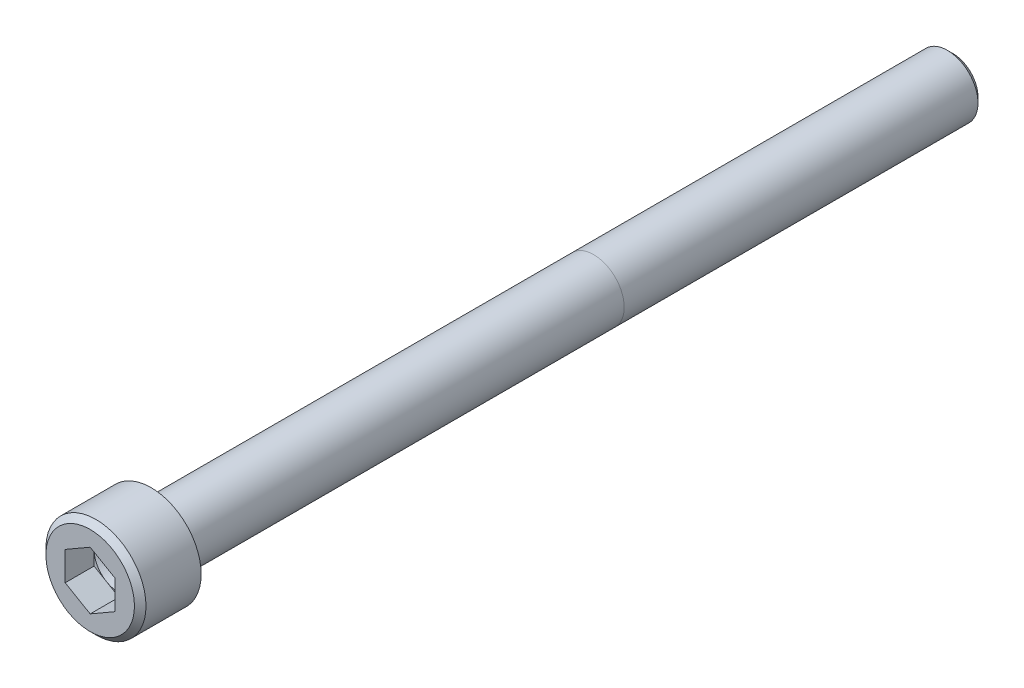
ISO-10303-21;
HEADER;
FILE_DESCRIPTION(('STEP AP214'),'2;1');
FILE_NAME('part.step','',(''),(''),'','','');
FILE_SCHEMA(('AUTOMOTIVE_DESIGN { 1 0 10303 214 1 1 1 1 }'));
ENDSEC;
DATA;
#1=APPLICATION_CONTEXT('core data for automotive mechanical design processes');
#2=APPLICATION_PROTOCOL_DEFINITION('international standard','automotive_design',2000,#1);
#3=PRODUCT_CONTEXT('',#1,'mechanical');
#4=PRODUCT('Part','Part','',(#3));
#5=PRODUCT_RELATED_PRODUCT_CATEGORY('part','',(#4));
#6=PRODUCT_DEFINITION_FORMATION('','',#4);
#7=PRODUCT_DEFINITION_CONTEXT('part definition',#1,'design');
#8=PRODUCT_DEFINITION('design','',#6,#7);
#9=PRODUCT_DEFINITION_SHAPE('','',#8);
#10=(LENGTH_UNIT() NAMED_UNIT(*) SI_UNIT(.MILLI.,.METRE.));
#11=(NAMED_UNIT(*) PLANE_ANGLE_UNIT() SI_UNIT($,.RADIAN.));
#12=(NAMED_UNIT(*) SI_UNIT($,.STERADIAN.) SOLID_ANGLE_UNIT());
#13=UNCERTAINTY_MEASURE_WITH_UNIT(LENGTH_MEASURE(1.E-05),#10,'distance_accuracy_value','');
#14=(GEOMETRIC_REPRESENTATION_CONTEXT(3) GLOBAL_UNCERTAINTY_ASSIGNED_CONTEXT((#13)) GLOBAL_UNIT_ASSIGNED_CONTEXT((#10,
#11,#12)) REPRESENTATION_CONTEXT('',''));
#15=CARTESIAN_POINT('',(0.,0.,0.));
#16=DIRECTION('',(0.,0.,1.));
#17=DIRECTION('',(1.,0.,0.));
#18=AXIS2_PLACEMENT_3D('',#15,#16,#17);
#19=CARTESIAN_POINT('',(0.,0.,-63.5));
#20=DIRECTION('',(0.,0.,1.));
#21=DIRECTION('',(1.,0.,0.));
#22=AXIS2_PLACEMENT_3D('',#19,#20,#21);
#23=CYLINDRICAL_SURFACE('',#22,2.413);
#24=CARTESIAN_POINT('',(0.,0.,-0.152399999999997));
#25=DIRECTION('',(0.,0.,1.));
#26=DIRECTION('',(1.,0.,0.));
#27=AXIS2_PLACEMENT_3D('',#24,#25,#26);
#28=CIRCLE('',#27,2.413);
#29=CARTESIAN_POINT('',(2.413,0.,-0.152399999999997));
#30=VERTEX_POINT('',#29);
#31=EDGE_CURVE('E137',#30,#30,#28,.F.);
#32=ORIENTED_EDGE('',*,*,#31,.T.);
#33=EDGE_LOOP('',(#32));
#34=FACE_BOUND('',#33,.T.);
#35=CARTESIAN_POINT('',(0.,0.,-35.052));
#36=DIRECTION('',(0.,0.,-1.));
#37=DIRECTION('',(-1.,0.,0.));
#38=AXIS2_PLACEMENT_3D('',#35,#36,#37);
#39=CIRCLE('',#38,2.413);
#40=CARTESIAN_POINT('',(-2.413,0.,-35.052));
#41=VERTEX_POINT('',#40);
#42=EDGE_CURVE('E11',#41,#41,#39,.T.);
#43=ORIENTED_EDGE('',*,*,#42,.F.);
#44=EDGE_LOOP('',(#43));
#45=FACE_BOUND('',#44,.T.);
#46=ADVANCED_FACE('F17',(#34,#45),#23,.T.);
#47=CARTESIAN_POINT('',(0.,0.,2.54));
#48=DIRECTION('',(0.,0.,1.));
#49=DIRECTION('',(1.,0.,0.));
#50=AXIS2_PLACEMENT_3D('',#47,#48,#49);
#51=PLANE('',#50);
#52=DIRECTION('',(0.,1.,0.));
#53=VECTOR('',#52,1.);
#54=CARTESIAN_POINT('',(-1.9812,0.,2.54));
#55=LINE('',#54,#53);
#56=CARTESIAN_POINT('',(-1.9812,0.,2.54));
#57=VERTEX_POINT('',#56);
#58=CARTESIAN_POINT('',(-1.9812,1.14384635331849,2.54));
#59=VERTEX_POINT('',#58);
#60=EDGE_CURVE('E194',#57,#59,#55,.T.);
#61=ORIENTED_EDGE('',*,*,#60,.F.);
#62=CARTESIAN_POINT('',(0.,0.,2.54));
#63=DIRECTION('',(0.,0.,-1.));
#64=DIRECTION('',(-1.,0.,0.));
#65=AXIS2_PLACEMENT_3D('',#62,#63,#64);
#66=CIRCLE('',#65,1.9812);
#67=CARTESIAN_POINT('',(-0.9906,1.71576952997773,2.54));
#68=VERTEX_POINT('',#67);
#69=EDGE_CURVE('E32',#57,#68,#66,.T.);
#70=ORIENTED_EDGE('',*,*,#69,.T.);
#71=DIRECTION('',(0.866025403784439,0.5,0.));
#72=VECTOR('',#71,1.);
#73=CARTESIAN_POINT('',(0.163354175866616,2.38200528404682,2.54));
#74=LINE('',#73,#72);
#75=EDGE_CURVE('E195',#59,#68,#74,.T.);
#76=ORIENTED_EDGE('',*,*,#75,.F.);
#77=EDGE_LOOP('',(#61,#70,#76));
#78=FACE_BOUND('',#77,.T.);
#79=ADVANCED_FACE('F105',(#78),#51,.T.);
#80=CARTESIAN_POINT('',(0.,2.28769270663697,2.54));
#81=VERTEX_POINT('',#80);
#82=EDGE_CURVE('E198',#68,#81,#74,.T.);
#83=ORIENTED_EDGE('',*,*,#82,.F.);
#84=CARTESIAN_POINT('',(0.9906,1.71576952997773,2.54));
#85=VERTEX_POINT('',#84);
#86=EDGE_CURVE('E139',#68,#85,#66,.T.);
#87=ORIENTED_EDGE('',*,*,#86,.T.);
#88=DIRECTION('',(0.866025403784439,-0.5,0.));
#89=VECTOR('',#88,1.);
#90=CARTESIAN_POINT('',(-0.163354175866613,2.38200528404682,2.54));
#91=LINE('',#90,#89);
#92=EDGE_CURVE('E199',#81,#85,#91,.T.);
#93=ORIENTED_EDGE('',*,*,#92,.F.);
#94=EDGE_LOOP('',(#83,#87,#93));
#95=FACE_BOUND('',#94,.T.);
#96=ADVANCED_FACE('F111',(#95),#51,.T.);
#97=CARTESIAN_POINT('',(1.9812,1.14384635331848,2.54));
#98=VERTEX_POINT('',#97);
#99=EDGE_CURVE('E166',#85,#98,#91,.T.);
#100=ORIENTED_EDGE('',*,*,#99,.F.);
#101=CARTESIAN_POINT('',(1.9812,0.,2.54));
#102=VERTEX_POINT('',#101);
#103=EDGE_CURVE('E206',#85,#102,#66,.T.);
#104=ORIENTED_EDGE('',*,*,#103,.T.);
#105=DIRECTION('',(0.,-1.,0.));
#106=VECTOR('',#105,1.);
#107=CARTESIAN_POINT('',(1.9812,0.,2.54));
#108=LINE('',#107,#106);
#109=EDGE_CURVE('E162',#98,#102,#108,.T.);
#110=ORIENTED_EDGE('',*,*,#109,.F.);
#111=EDGE_LOOP('',(#100,#104,#110));
#112=FACE_BOUND('',#111,.T.);
#113=ADVANCED_FACE('F223',(#112),#51,.T.);
#114=CARTESIAN_POINT('',(1.9812,-1.14384635331848,2.54));
#115=VERTEX_POINT('',#114);
#116=EDGE_CURVE('E182',#102,#115,#108,.T.);
#117=ORIENTED_EDGE('',*,*,#116,.F.);
#118=CARTESIAN_POINT('',(0.9906,-1.71576952997773,2.54));
#119=VERTEX_POINT('',#118);
#120=EDGE_CURVE('E211',#102,#119,#66,.T.);
#121=ORIENTED_EDGE('',*,*,#120,.T.);
#122=DIRECTION('',(-0.866025403784438,-0.5,0.));
#123=VECTOR('',#122,1.);
#124=CARTESIAN_POINT('',(2.14455417586661,-1.04953377590864,2.54));
#125=LINE('',#124,#123);
#126=EDGE_CURVE('E183',#115,#119,#125,.T.);
#127=ORIENTED_EDGE('',*,*,#126,.F.);
#128=EDGE_LOOP('',(#117,#121,#127));
#129=FACE_BOUND('',#128,.T.);
#130=ADVANCED_FACE('F224',(#129),#51,.T.);
#131=CARTESIAN_POINT('',(0.,-2.28769270663697,2.54));
#132=VERTEX_POINT('',#131);
#133=EDGE_CURVE('E186',#119,#132,#125,.T.);
#134=ORIENTED_EDGE('',*,*,#133,.F.);
#135=CARTESIAN_POINT('',(-0.9906,-1.71576952997773,2.54));
#136=VERTEX_POINT('',#135);
#137=EDGE_CURVE('E207',#119,#136,#66,.T.);
#138=ORIENTED_EDGE('',*,*,#137,.T.);
#139=DIRECTION('',(-0.866025403784439,0.5,0.));
#140=VECTOR('',#139,1.);
#141=CARTESIAN_POINT('',(-2.14455417586661,-1.04953377590865,2.54));
#142=LINE('',#141,#140);
#143=EDGE_CURVE('E187',#132,#136,#142,.T.);
#144=ORIENTED_EDGE('',*,*,#143,.F.);
#145=EDGE_LOOP('',(#134,#138,#144));
#146=FACE_BOUND('',#145,.T.);
#147=ADVANCED_FACE('F124',(#146),#51,.T.);
#148=CARTESIAN_POINT('',(0.,0.,4.826));
#149=DIRECTION('',(0.,0.,1.));
#150=DIRECTION('',(1.,0.,0.));
#151=AXIS2_PLACEMENT_3D('',#148,#149,#150);
#152=PLANE('',#151);
#153=CARTESIAN_POINT('',(0.,0.,4.826));
#154=DIRECTION('',(0.,0.,1.));
#155=DIRECTION('',(1.,0.,0.));
#156=AXIS2_PLACEMENT_3D('',#153,#154,#155);
#157=CIRCLE('',#156,3.5052);
#158=CARTESIAN_POINT('',(3.5052,0.,4.826));
#159=VERTEX_POINT('',#158);
#160=EDGE_CURVE('E144',#159,#159,#157,.T.);
#161=ORIENTED_EDGE('',*,*,#160,.T.);
#162=EDGE_LOOP('',(#161));
#163=FACE_BOUND('',#162,.T.);
#164=DIRECTION('',(0.866025403784439,0.5,0.));
#165=VECTOR('',#164,1.);
#166=CARTESIAN_POINT('',(0.163354175866616,2.38200528404682,4.826));
#167=LINE('',#166,#165);
#168=CARTESIAN_POINT('',(-1.9812,1.14384635331849,4.826));
#169=VERTEX_POINT('',#168);
#170=CARTESIAN_POINT('',(0.,2.28769270663697,4.826));
#171=VERTEX_POINT('',#170);
#172=EDGE_CURVE('E174',#169,#171,#167,.T.);
#173=ORIENTED_EDGE('',*,*,#172,.T.);
#174=DIRECTION('',(0.866025403784439,-0.5,0.));
#175=VECTOR('',#174,1.);
#176=CARTESIAN_POINT('',(-0.163354175866613,2.38200528404682,4.826));
#177=LINE('',#176,#175);
#178=CARTESIAN_POINT('',(1.9812,1.14384635331848,4.826));
#179=VERTEX_POINT('',#178);
#180=EDGE_CURVE('E177',#171,#179,#177,.T.);
#181=ORIENTED_EDGE('',*,*,#180,.T.);
#182=DIRECTION('',(0.,-1.,0.));
#183=VECTOR('',#182,1.);
#184=CARTESIAN_POINT('',(1.9812,0.,4.826));
#185=LINE('',#184,#183);
#186=CARTESIAN_POINT('',(1.9812,-1.14384635331848,4.826));
#187=VERTEX_POINT('',#186);
#188=EDGE_CURVE('E163',#179,#187,#185,.T.);
#189=ORIENTED_EDGE('',*,*,#188,.T.);
#190=DIRECTION('',(-0.866025403784438,-0.5,0.));
#191=VECTOR('',#190,1.);
#192=CARTESIAN_POINT('',(2.14455417586661,-1.04953377590864,4.826));
#193=LINE('',#192,#191);
#194=CARTESIAN_POINT('',(0.,-2.28769270663697,4.826));
#195=VERTEX_POINT('',#194);
#196=EDGE_CURVE('E40',#187,#195,#193,.T.);
#197=ORIENTED_EDGE('',*,*,#196,.T.);
#198=DIRECTION('',(-0.866025403784439,0.5,0.));
#199=VECTOR('',#198,1.);
#200=CARTESIAN_POINT('',(-2.14455417586661,-1.04953377590865,4.826));
#201=LINE('',#200,#199);
#202=CARTESIAN_POINT('',(-1.9812,-1.14384635331849,4.826));
#203=VERTEX_POINT('',#202);
#204=EDGE_CURVE('E168',#195,#203,#201,.T.);
#205=ORIENTED_EDGE('',*,*,#204,.T.);
#206=DIRECTION('',(0.,1.,0.));
#207=VECTOR('',#206,1.);
#208=CARTESIAN_POINT('',(-1.9812,0.,4.826));
#209=LINE('',#208,#207);
#210=EDGE_CURVE('E171',#203,#169,#209,.T.);
#211=ORIENTED_EDGE('',*,*,#210,.T.);
#212=EDGE_LOOP('',(#173,#181,#189,#197,#205,#211));
#213=FACE_BOUND('',#212,.T.);
#214=ADVANCED_FACE('F248',(#163,#213),#152,.T.);
#215=CARTESIAN_POINT('',(0.,0.,4.826));
#216=DIRECTION('',(0.,0.,-1.));
#217=DIRECTION('',(-1.,0.,0.));
#218=AXIS2_PLACEMENT_3D('',#215,#216,#217);
#219=CYLINDRICAL_SURFACE('',#218,3.9624);
#220=CARTESIAN_POINT('',(0.,0.,4.3688));
#221=DIRECTION('',(0.,0.,1.));
#222=DIRECTION('',(1.,0.,0.));
#223=AXIS2_PLACEMENT_3D('',#220,#221,#222);
#224=CIRCLE('',#223,3.9624);
#225=CARTESIAN_POINT('',(3.9624,0.,4.3688));
#226=VERTEX_POINT('',#225);
#227=EDGE_CURVE('E140',#226,#226,#224,.F.);
#228=ORIENTED_EDGE('',*,*,#227,.T.);
#229=EDGE_LOOP('',(#228));
#230=FACE_BOUND('',#229,.T.);
#231=CARTESIAN_POINT('',(0.,0.,0.));
#232=DIRECTION('',(0.,0.,1.));
#233=DIRECTION('',(1.,0.,0.));
#234=AXIS2_PLACEMENT_3D('',#231,#232,#233);
#235=CIRCLE('',#234,3.9624);
#236=CARTESIAN_POINT('',(3.9624,0.,0.));
#237=VERTEX_POINT('',#236);
#238=EDGE_CURVE('E147',#237,#237,#235,.T.);
#239=ORIENTED_EDGE('',*,*,#238,.T.);
#240=EDGE_LOOP('',(#239));
#241=FACE_BOUND('',#240,.T.);
#242=ADVANCED_FACE('F250',(#230,#241),#219,.T.);
#243=CARTESIAN_POINT('',(0.,0.,0.));
#244=DIRECTION('',(0.,0.,1.));
#245=DIRECTION('',(1.,0.,0.));
#246=AXIS2_PLACEMENT_3D('',#243,#244,#245);
#247=PLANE('',#246);
#248=CARTESIAN_POINT('',(0.,0.,0.));
#249=DIRECTION('',(0.,0.,1.));
#250=DIRECTION('',(1.,0.,0.));
#251=AXIS2_PLACEMENT_3D('',#248,#249,#250);
#252=CIRCLE('',#251,2.5654);
#253=CARTESIAN_POINT('',(2.5654,0.,0.));
#254=VERTEX_POINT('',#253);
#255=EDGE_CURVE('E132',#254,#254,#252,.T.);
#256=ORIENTED_EDGE('',*,*,#255,.T.);
#257=EDGE_LOOP('',(#256));
#258=FACE_BOUND('',#257,.T.);
#259=ORIENTED_EDGE('',*,*,#238,.F.);
#260=EDGE_LOOP('',(#259));
#261=FACE_BOUND('',#260,.T.);
#262=ADVANCED_FACE('F257',(#258,#261),#247,.F.);
#263=CARTESIAN_POINT('',(0.,0.,4.826));
#264=DIRECTION('',(0.,0.,-1.));
#265=DIRECTION('',(-1.,0.,0.));
#266=AXIS2_PLACEMENT_3D('',#263,#264,#265);
#267=CONICAL_SURFACE('',#266,3.5052,0.785398163397449);
#268=ORIENTED_EDGE('',*,*,#227,.F.);
#269=EDGE_LOOP('',(#268));
#270=FACE_BOUND('',#269,.T.);
#271=ORIENTED_EDGE('',*,*,#160,.F.);
#272=EDGE_LOOP('',(#271));
#273=FACE_BOUND('',#272,.T.);
#274=ADVANCED_FACE('F264',(#270,#273),#267,.T.);
#275=CARTESIAN_POINT('',(-0.163354175866613,2.38200528404682,2.54));
#276=DIRECTION('',(-0.5,-0.866025403784439,0.));
#277=DIRECTION('',(0.866025403784439,-0.5,0.));
#278=AXIS2_PLACEMENT_3D('',#275,#276,#277);
#279=PLANE('',#278);
#280=ORIENTED_EDGE('',*,*,#180,.F.);
#281=DIRECTION('',(0.,0.,1.));
#282=VECTOR('',#281,1.);
#283=CARTESIAN_POINT('',(0.,2.28769270663697,2.54));
#284=LINE('',#283,#282);
#285=EDGE_CURVE('E150',#81,#171,#284,.T.);
#286=ORIENTED_EDGE('',*,*,#285,.F.);
#287=ORIENTED_EDGE('',*,*,#92,.T.);
#288=ORIENTED_EDGE('',*,*,#99,.T.);
#289=DIRECTION('',(0.,0.,1.));
#290=VECTOR('',#289,1.);
#291=CARTESIAN_POINT('',(1.9812,1.14384635331848,2.54));
#292=LINE('',#291,#290);
#293=EDGE_CURVE('E160',#98,#179,#292,.T.);
#294=ORIENTED_EDGE('',*,*,#293,.T.);
#295=EDGE_LOOP('',(#280,#286,#287,#288,#294));
#296=FACE_BOUND('',#295,.T.);
#297=ADVANCED_FACE('F230',(#296),#279,.T.);
#298=CARTESIAN_POINT('',(0.163354175866616,2.38200528404682,2.54));
#299=DIRECTION('',(0.5,-0.866025403784438,0.));
#300=DIRECTION('',(0.866025403784438,0.5,0.));
#301=AXIS2_PLACEMENT_3D('',#298,#299,#300);
#302=PLANE('',#301);
#303=ORIENTED_EDGE('',*,*,#172,.F.);
#304=DIRECTION('',(0.,0.,1.));
#305=VECTOR('',#304,1.);
#306=CARTESIAN_POINT('',(-1.9812,1.14384635331849,2.54));
#307=LINE('',#306,#305);
#308=EDGE_CURVE('E152',#59,#169,#307,.T.);
#309=ORIENTED_EDGE('',*,*,#308,.F.);
#310=ORIENTED_EDGE('',*,*,#75,.T.);
#311=ORIENTED_EDGE('',*,*,#82,.T.);
#312=ORIENTED_EDGE('',*,*,#285,.T.);
#313=EDGE_LOOP('',(#303,#309,#310,#311,#312));
#314=FACE_BOUND('',#313,.T.);
#315=ADVANCED_FACE('F237',(#314),#302,.T.);
#316=CARTESIAN_POINT('',(-1.9812,0.,2.54));
#317=DIRECTION('',(1.,0.,0.));
#318=DIRECTION('',(0.,0.,-1.));
#319=AXIS2_PLACEMENT_3D('',#316,#317,#318);
#320=PLANE('',#319);
#321=ORIENTED_EDGE('',*,*,#210,.F.);
#322=DIRECTION('',(0.,0.,1.));
#323=VECTOR('',#322,1.);
#324=CARTESIAN_POINT('',(-1.9812,-1.14384635331849,2.54));
#325=LINE('',#324,#323);
#326=CARTESIAN_POINT('',(-1.9812,-1.14384635331849,2.54));
#327=VERTEX_POINT('',#326);
#328=EDGE_CURVE('E154',#327,#203,#325,.T.);
#329=ORIENTED_EDGE('',*,*,#328,.F.);
#330=EDGE_CURVE('E191',#327,#57,#55,.T.);
#331=ORIENTED_EDGE('',*,*,#330,.T.);
#332=ORIENTED_EDGE('',*,*,#60,.T.);
#333=ORIENTED_EDGE('',*,*,#308,.T.);
#334=EDGE_LOOP('',(#321,#329,#331,#332,#333));
#335=FACE_BOUND('',#334,.T.);
#336=ADVANCED_FACE('F241',(#335),#320,.T.);
#337=CARTESIAN_POINT('',(-2.14455417586661,-1.04953377590865,2.54));
#338=DIRECTION('',(0.5,0.866025403784439,0.));
#339=DIRECTION('',(-0.866025403784439,0.5,0.));
#340=AXIS2_PLACEMENT_3D('',#337,#338,#339);
#341=PLANE('',#340);
#342=ORIENTED_EDGE('',*,*,#204,.F.);
#343=DIRECTION('',(0.,0.,1.));
#344=VECTOR('',#343,1.);
#345=CARTESIAN_POINT('',(0.,-2.28769270663697,2.54));
#346=LINE('',#345,#344);
#347=EDGE_CURVE('E156',#132,#195,#346,.T.);
#348=ORIENTED_EDGE('',*,*,#347,.F.);
#349=ORIENTED_EDGE('',*,*,#143,.T.);
#350=EDGE_CURVE('E190',#136,#327,#142,.T.);
#351=ORIENTED_EDGE('',*,*,#350,.T.);
#352=ORIENTED_EDGE('',*,*,#328,.T.);
#353=EDGE_LOOP('',(#342,#348,#349,#351,#352));
#354=FACE_BOUND('',#353,.T.);
#355=ADVANCED_FACE('F245',(#354),#341,.T.);
#356=CARTESIAN_POINT('',(2.14455417586661,-1.04953377590864,2.54));
#357=DIRECTION('',(-0.5,0.866025403784438,0.));
#358=DIRECTION('',(-0.866025403784438,-0.5,0.));
#359=AXIS2_PLACEMENT_3D('',#356,#357,#358);
#360=PLANE('',#359);
#361=ORIENTED_EDGE('',*,*,#196,.F.);
#362=DIRECTION('',(0.,0.,1.));
#363=VECTOR('',#362,1.);
#364=CARTESIAN_POINT('',(1.9812,-1.14384635331848,2.54));
#365=LINE('',#364,#363);
#366=EDGE_CURVE('E158',#115,#187,#365,.T.);
#367=ORIENTED_EDGE('',*,*,#366,.F.);
#368=ORIENTED_EDGE('',*,*,#126,.T.);
#369=ORIENTED_EDGE('',*,*,#133,.T.);
#370=ORIENTED_EDGE('',*,*,#347,.T.);
#371=EDGE_LOOP('',(#361,#367,#368,#369,#370));
#372=FACE_BOUND('',#371,.T.);
#373=ADVANCED_FACE('F246',(#372),#360,.T.);
#374=CARTESIAN_POINT('',(1.9812,0.,2.54));
#375=DIRECTION('',(-1.,0.,0.));
#376=DIRECTION('',(0.,0.,1.));
#377=AXIS2_PLACEMENT_3D('',#374,#375,#376);
#378=PLANE('',#377);
#379=ORIENTED_EDGE('',*,*,#188,.F.);
#380=ORIENTED_EDGE('',*,*,#293,.F.);
#381=ORIENTED_EDGE('',*,*,#109,.T.);
#382=ORIENTED_EDGE('',*,*,#116,.T.);
#383=ORIENTED_EDGE('',*,*,#366,.T.);
#384=EDGE_LOOP('',(#379,#380,#381,#382,#383));
#385=FACE_BOUND('',#384,.T.);
#386=ADVANCED_FACE('F122',(#385),#378,.T.);
#387=ORIENTED_EDGE('',*,*,#350,.F.);
#388=EDGE_CURVE('E143',#136,#57,#66,.T.);
#389=ORIENTED_EDGE('',*,*,#388,.T.);
#390=ORIENTED_EDGE('',*,*,#330,.F.);
#391=EDGE_LOOP('',(#387,#389,#390));
#392=FACE_BOUND('',#391,.T.);
#393=ADVANCED_FACE('F114',(#392),#51,.T.);
#394=ORIENTED_EDGE('',*,*,#42,.T.);
#395=EDGE_LOOP('',(#394));
#396=FACE_BOUND('',#395,.T.);
#397=CARTESIAN_POINT('',(0.,0.,-63.07105761938));
#398=DIRECTION('',(0.,0.,-1.));
#399=DIRECTION('',(-1.,0.,0.));
#400=AXIS2_PLACEMENT_3D('',#397,#398,#399);
#401=CIRCLE('',#400,2.413);
#402=CARTESIAN_POINT('',(-2.413,0.,-63.07105761938));
#403=VERTEX_POINT('',#402);
#404=EDGE_CURVE('E25',#403,#403,#401,.F.);
#405=ORIENTED_EDGE('',*,*,#404,.T.);
#406=EDGE_LOOP('',(#405));
#407=FACE_BOUND('',#406,.T.);
#408=ADVANCED_FACE('F101',(#396,#407),#23,.T.);
#409=CARTESIAN_POINT('',(0.,0.,-63.5));
#410=DIRECTION('',(0.,0.,-1.));
#411=DIRECTION('',(1.,0.,0.));
#412=AXIS2_PLACEMENT_3D('',#409,#410,#411);
#413=PLANE('',#412);
#414=CARTESIAN_POINT('',(0.,0.,-63.5));
#415=DIRECTION('',(0.,0.,-1.));
#416=DIRECTION('',(-1.,0.,0.));
#417=AXIS2_PLACEMENT_3D('',#414,#415,#416);
#418=CIRCLE('',#417,1.98405761938);
#419=CARTESIAN_POINT('',(-1.98405761938,0.,-63.5));
#420=VERTEX_POINT('',#419);
#421=EDGE_CURVE('E130',#420,#420,#418,.T.);
#422=ORIENTED_EDGE('',*,*,#421,.T.);
#423=EDGE_LOOP('',(#422));
#424=FACE_BOUND('',#423,.T.);
#425=ADVANCED_FACE('F93',(#424),#413,.T.);
#426=CARTESIAN_POINT('',(0.,0.,1.39615364668151));
#427=DIRECTION('',(0.,0.,1.));
#428=DIRECTION('',(1.,0.,0.));
#429=AXIS2_PLACEMENT_3D('',#426,#427,#428);
#430=CONICAL_SURFACE('',#429,0.,1.0471975511966);
#431=ORIENTED_EDGE('',*,*,#69,.F.);
#432=ORIENTED_EDGE('',*,*,#388,.F.);
#433=ORIENTED_EDGE('',*,*,#137,.F.);
#434=ORIENTED_EDGE('',*,*,#120,.F.);
#435=ORIENTED_EDGE('',*,*,#103,.F.);
#436=ORIENTED_EDGE('',*,*,#86,.F.);
#437=EDGE_LOOP('',(#431,#432,#433,#434,#435,#436));
#438=FACE_BOUND('',#437,.T.);
#439=CARTESIAN_POINT('',(0.,0.,1.39615364668151));
#440=VERTEX_POINT('',#439);
#441=VERTEX_LOOP('',#440);
#442=FACE_BOUND('',#441,.T.);
#443=ADVANCED_FACE('F90',(#438,#442),#430,.F.);
#444=CARTESIAN_POINT('',(0.,0.,-0.152399999999997));
#445=DIRECTION('',(0.,0.,1.));
#446=DIRECTION('',(1.,0.,0.));
#447=AXIS2_PLACEMENT_3D('',#444,#445,#446);
#448=TOROIDAL_SURFACE('',#447,2.5654,0.1524);
#449=ORIENTED_EDGE('',*,*,#255,.F.);
#450=EDGE_LOOP('',(#449));
#451=FACE_BOUND('',#450,.T.);
#452=ORIENTED_EDGE('',*,*,#31,.F.);
#453=EDGE_LOOP('',(#452));
#454=FACE_BOUND('',#453,.T.);
#455=ADVANCED_FACE('F92',(#451,#454),#448,.F.);
#456=CARTESIAN_POINT('',(0.,0.,-63.5));
#457=DIRECTION('',(0.,0.,1.));
#458=DIRECTION('',(1.,0.,0.));
#459=AXIS2_PLACEMENT_3D('',#456,#457,#458);
#460=CONICAL_SURFACE('',#459,1.98405761938,0.785398163397453);
#461=ORIENTED_EDGE('',*,*,#404,.F.);
#462=EDGE_LOOP('',(#461));
#463=FACE_BOUND('',#462,.T.);
#464=ORIENTED_EDGE('',*,*,#421,.F.);
#465=EDGE_LOOP('',(#464));
#466=FACE_BOUND('',#465,.T.);
#467=ADVANCED_FACE('F19',(#463,#466),#460,.T.);
#468=CLOSED_SHELL('',(#46,#79,#96,#113,#130,#147,#214,#242,#262,#274,#297,#315,#336,#355,#373,
#386,#393,#408,#425,#443,#455,#467));
#469=MANIFOLD_SOLID_BREP('B1',#468);
#470=ADVANCED_BREP_SHAPE_REPRESENTATION('',(#18,#469),#14);
#471=SHAPE_DEFINITION_REPRESENTATION(#9,#470);
ENDSEC;
END-ISO-10303-21;
